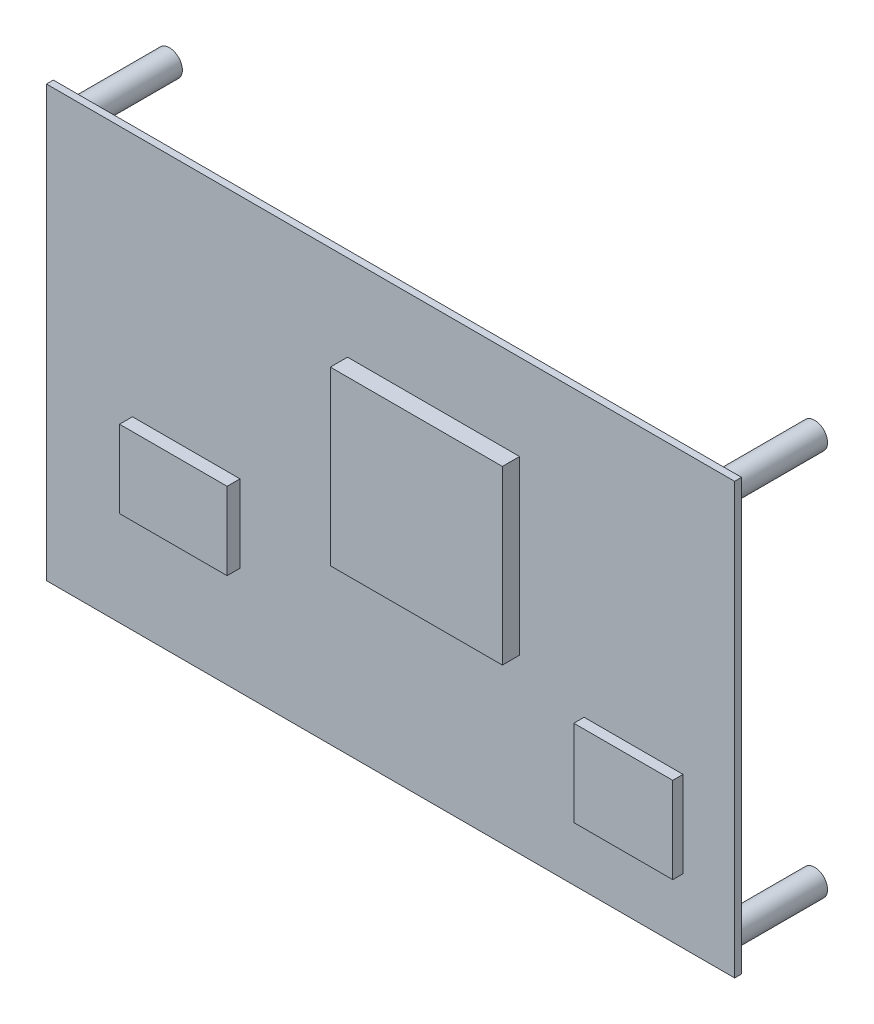
ISO-10303-21;
HEADER;
FILE_DESCRIPTION(('STEP AP214'),'2;1');
FILE_NAME('part.step','',(''),(''),'','','');
FILE_SCHEMA(('AUTOMOTIVE_DESIGN { 1 0 10303 214 1 1 1 1 }'));
ENDSEC;
DATA;
#1=APPLICATION_CONTEXT('core data for automotive mechanical design processes');
#2=APPLICATION_PROTOCOL_DEFINITION('international standard','automotive_design',2000,#1);
#3=PRODUCT_CONTEXT('',#1,'mechanical');
#4=PRODUCT('Part','Part','',(#3));
#5=PRODUCT_RELATED_PRODUCT_CATEGORY('part','',(#4));
#6=PRODUCT_DEFINITION_FORMATION('','',#4);
#7=PRODUCT_DEFINITION_CONTEXT('part definition',#1,'design');
#8=PRODUCT_DEFINITION('design','',#6,#7);
#9=PRODUCT_DEFINITION_SHAPE('','',#8);
#10=(LENGTH_UNIT() NAMED_UNIT(*) SI_UNIT(.MILLI.,.METRE.));
#11=(NAMED_UNIT(*) PLANE_ANGLE_UNIT() SI_UNIT($,.RADIAN.));
#12=(NAMED_UNIT(*) SI_UNIT($,.STERADIAN.) SOLID_ANGLE_UNIT());
#13=UNCERTAINTY_MEASURE_WITH_UNIT(LENGTH_MEASURE(1.E-05),#10,'distance_accuracy_value','');
#14=(GEOMETRIC_REPRESENTATION_CONTEXT(3) GLOBAL_UNCERTAINTY_ASSIGNED_CONTEXT((#13)) GLOBAL_UNIT_ASSIGNED_CONTEXT((#10,
#11,#12)) REPRESENTATION_CONTEXT('',''));
#15=CARTESIAN_POINT('',(0.,0.,0.));
#16=DIRECTION('',(0.,0.,1.));
#17=DIRECTION('',(1.,0.,0.));
#18=AXIS2_PLACEMENT_3D('',#15,#16,#17);
#19=CARTESIAN_POINT('',(482.,10.,345.));
#20=DIRECTION('',(0.,0.,-1.));
#21=DIRECTION('',(-1.,0.,0.));
#22=AXIS2_PLACEMENT_3D('',#19,#20,#21);
#23=CYLINDRICAL_SURFACE('',#22,3.);
#24=CARTESIAN_POINT('',(482.,10.,345.));
#25=DIRECTION('',(0.,0.,1.));
#26=DIRECTION('',(1.,0.,0.));
#27=AXIS2_PLACEMENT_3D('',#24,#25,#26);
#28=CIRCLE('',#27,3.);
#29=CARTESIAN_POINT('',(485.,10.,345.));
#30=VERTEX_POINT('',#29);
#31=EDGE_CURVE('E11',#30,#30,#28,.T.);
#32=ORIENTED_EDGE('',*,*,#31,.F.);
#33=EDGE_LOOP('',(#32));
#34=FACE_BOUND('',#33,.T.);
#35=CARTESIAN_POINT('',(482.,10.,323.));
#36=DIRECTION('',(0.,0.,1.));
#37=DIRECTION('',(1.,0.,0.));
#38=AXIS2_PLACEMENT_3D('',#35,#36,#37);
#39=CIRCLE('',#38,3.);
#40=CARTESIAN_POINT('',(485.,10.,323.));
#41=VERTEX_POINT('',#40);
#42=EDGE_CURVE('E46',#41,#41,#39,.T.);
#43=ORIENTED_EDGE('',*,*,#42,.T.);
#44=EDGE_LOOP('',(#43));
#45=FACE_BOUND('',#44,.T.);
#46=ADVANCED_FACE('F43',(#34,#45),#23,.T.);
#47=CARTESIAN_POINT('',(482.,10.,323.));
#48=DIRECTION('',(0.,0.,1.));
#49=DIRECTION('',(1.,0.,0.));
#50=AXIS2_PLACEMENT_3D('',#47,#48,#49);
#51=PLANE('',#50);
#52=ORIENTED_EDGE('',*,*,#42,.F.);
#53=EDGE_LOOP('',(#52));
#54=FACE_BOUND('',#53,.T.);
#55=ADVANCED_FACE('F299',(#54),#51,.F.);
#56=CARTESIAN_POINT('',(547.,85.,350.6));
#57=DIRECTION('',(1.,0.,0.));
#58=DIRECTION('',(0.,0.,-1.));
#59=AXIS2_PLACEMENT_3D('',#56,#57,#58);
#60=PLANE('',#59);
#61=DIRECTION('',(0.,-1.,0.));
#62=VECTOR('',#61,1.);
#63=CARTESIAN_POINT('',(547.,85.,346.6));
#64=LINE('',#63,#62);
#65=CARTESIAN_POINT('',(547.,85.,346.6));
#66=VERTEX_POINT('',#65);
#67=CARTESIAN_POINT('',(547.,45.,346.6));
#68=VERTEX_POINT('',#67);
#69=EDGE_CURVE('E257',#66,#68,#64,.T.);
#70=ORIENTED_EDGE('',*,*,#69,.T.);
#71=DIRECTION('',(0.,0.,-1.));
#72=VECTOR('',#71,1.);
#73=CARTESIAN_POINT('',(547.,45.,350.6));
#74=LINE('',#73,#72);
#75=CARTESIAN_POINT('',(547.,45.,350.6));
#76=VERTEX_POINT('',#75);
#77=EDGE_CURVE('E288',#76,#68,#74,.T.);
#78=ORIENTED_EDGE('',*,*,#77,.F.);
#79=DIRECTION('',(0.,-1.,0.));
#80=VECTOR('',#79,1.);
#81=CARTESIAN_POINT('',(547.,85.,350.6));
#82=LINE('',#81,#80);
#83=CARTESIAN_POINT('',(547.,85.,350.6));
#84=VERTEX_POINT('',#83);
#85=EDGE_CURVE('E263',#84,#76,#82,.T.);
#86=ORIENTED_EDGE('',*,*,#85,.F.);
#87=DIRECTION('',(0.,0.,-1.));
#88=VECTOR('',#87,1.);
#89=CARTESIAN_POINT('',(547.,85.,350.6));
#90=LINE('',#89,#88);
#91=EDGE_CURVE('E271',#84,#66,#90,.T.);
#92=ORIENTED_EDGE('',*,*,#91,.T.);
#93=EDGE_LOOP('',(#70,#78,#86,#92));
#94=FACE_BOUND('',#93,.T.);
#95=ADVANCED_FACE('F300',(#94),#60,.F.);
#96=CARTESIAN_POINT('',(547.,45.,350.6));
#97=DIRECTION('',(0.,1.,0.));
#98=DIRECTION('',(0.,0.,1.));
#99=AXIS2_PLACEMENT_3D('',#96,#97,#98);
#100=PLANE('',#99);
#101=DIRECTION('',(1.,0.,0.));
#102=VECTOR('',#101,1.);
#103=CARTESIAN_POINT('',(547.,45.,346.6));
#104=LINE('',#103,#102);
#105=CARTESIAN_POINT('',(587.,45.,346.6));
#106=VERTEX_POINT('',#105);
#107=EDGE_CURVE('E273',#68,#106,#104,.T.);
#108=ORIENTED_EDGE('',*,*,#107,.T.);
#109=DIRECTION('',(0.,0.,-1.));
#110=VECTOR('',#109,1.);
#111=CARTESIAN_POINT('',(587.,45.,350.6));
#112=LINE('',#111,#110);
#113=CARTESIAN_POINT('',(587.,45.,350.6));
#114=VERTEX_POINT('',#113);
#115=EDGE_CURVE('E289',#114,#106,#112,.T.);
#116=ORIENTED_EDGE('',*,*,#115,.F.);
#117=DIRECTION('',(1.,0.,0.));
#118=VECTOR('',#117,1.);
#119=CARTESIAN_POINT('',(547.,45.,350.6));
#120=LINE('',#119,#118);
#121=EDGE_CURVE('E264',#76,#114,#120,.T.);
#122=ORIENTED_EDGE('',*,*,#121,.F.);
#123=ORIENTED_EDGE('',*,*,#77,.T.);
#124=EDGE_LOOP('',(#108,#116,#122,#123));
#125=FACE_BOUND('',#124,.T.);
#126=ADVANCED_FACE('F303',(#125),#100,.F.);
#127=CARTESIAN_POINT('',(587.,45.,350.6));
#128=DIRECTION('',(-1.,0.,0.));
#129=DIRECTION('',(0.,0.,1.));
#130=AXIS2_PLACEMENT_3D('',#127,#128,#129);
#131=PLANE('',#130);
#132=DIRECTION('',(0.,1.,0.));
#133=VECTOR('',#132,1.);
#134=CARTESIAN_POINT('',(587.,45.,346.6));
#135=LINE('',#134,#133);
#136=CARTESIAN_POINT('',(587.,85.,346.6));
#137=VERTEX_POINT('',#136);
#138=EDGE_CURVE('E280',#106,#137,#135,.T.);
#139=ORIENTED_EDGE('',*,*,#138,.T.);
#140=DIRECTION('',(0.,0.,-1.));
#141=VECTOR('',#140,1.);
#142=CARTESIAN_POINT('',(587.,85.,350.6));
#143=LINE('',#142,#141);
#144=CARTESIAN_POINT('',(587.,85.,350.6));
#145=VERTEX_POINT('',#144);
#146=EDGE_CURVE('E283',#145,#137,#143,.T.);
#147=ORIENTED_EDGE('',*,*,#146,.F.);
#148=DIRECTION('',(0.,1.,0.));
#149=VECTOR('',#148,1.);
#150=CARTESIAN_POINT('',(587.,45.,350.6));
#151=LINE('',#150,#149);
#152=EDGE_CURVE('E268',#114,#145,#151,.T.);
#153=ORIENTED_EDGE('',*,*,#152,.F.);
#154=ORIENTED_EDGE('',*,*,#115,.T.);
#155=EDGE_LOOP('',(#139,#147,#153,#154));
#156=FACE_BOUND('',#155,.T.);
#157=ADVANCED_FACE('F315',(#156),#131,.F.);
#158=CARTESIAN_POINT('',(587.,85.,350.6));
#159=DIRECTION('',(0.,-1.,0.));
#160=DIRECTION('',(0.,0.,-1.));
#161=AXIS2_PLACEMENT_3D('',#158,#159,#160);
#162=PLANE('',#161);
#163=DIRECTION('',(-1.,0.,0.));
#164=VECTOR('',#163,1.);
#165=CARTESIAN_POINT('',(587.,85.,346.6));
#166=LINE('',#165,#164);
#167=EDGE_CURVE('E266',#137,#66,#166,.T.);
#168=ORIENTED_EDGE('',*,*,#167,.T.);
#169=ORIENTED_EDGE('',*,*,#91,.F.);
#170=DIRECTION('',(-1.,0.,0.));
#171=VECTOR('',#170,1.);
#172=CARTESIAN_POINT('',(587.,85.,350.6));
#173=LINE('',#172,#171);
#174=EDGE_CURVE('E59',#145,#84,#173,.T.);
#175=ORIENTED_EDGE('',*,*,#174,.F.);
#176=ORIENTED_EDGE('',*,*,#146,.T.);
#177=EDGE_LOOP('',(#168,#169,#175,#176));
#178=FACE_BOUND('',#177,.T.);
#179=ADVANCED_FACE('F312',(#178),#162,.F.);
#180=CARTESIAN_POINT('',(0.,0.,350.6));
#181=DIRECTION('',(0.,0.,1.));
#182=DIRECTION('',(1.,0.,0.));
#183=AXIS2_PLACEMENT_3D('',#180,#181,#182);
#184=PLANE('',#183);
#185=ORIENTED_EDGE('',*,*,#85,.T.);
#186=ORIENTED_EDGE('',*,*,#121,.T.);
#187=ORIENTED_EDGE('',*,*,#152,.T.);
#188=ORIENTED_EDGE('',*,*,#174,.T.);
#189=EDGE_LOOP('',(#185,#186,#187,#188));
#190=FACE_BOUND('',#189,.T.);
#191=ADVANCED_FACE('F317',(#190),#184,.T.);
#192=CARTESIAN_POINT('',(0.,0.,346.6));
#193=DIRECTION('',(0.,0.,1.));
#194=DIRECTION('',(1.,0.,0.));
#195=AXIS2_PLACEMENT_3D('',#192,#193,#194);
#196=PLANE('',#195);
#197=DIRECTION('',(1.,0.,0.));
#198=VECTOR('',#197,1.);
#199=CARTESIAN_POINT('',(602.,20.,346.6));
#200=LINE('',#199,#198);
#201=CARTESIAN_POINT('',(602.,20.,346.6));
#202=VERTEX_POINT('',#201);
#203=CARTESIAN_POINT('',(625.,20.,346.6));
#204=VERTEX_POINT('',#203);
#205=EDGE_CURVE('E612',#202,#204,#200,.T.);
#206=ORIENTED_EDGE('',*,*,#205,.F.);
#207=DIRECTION('',(0.,-1.,0.));
#208=VECTOR('',#207,1.);
#209=CARTESIAN_POINT('',(602.,40.,346.6));
#210=LINE('',#209,#208);
#211=CARTESIAN_POINT('',(602.,40.,346.6));
#212=VERTEX_POINT('',#211);
#213=EDGE_CURVE('E173',#212,#202,#210,.T.);
#214=ORIENTED_EDGE('',*,*,#213,.F.);
#215=DIRECTION('',(-1.,0.,0.));
#216=VECTOR('',#215,1.);
#217=CARTESIAN_POINT('',(625.,40.,346.6));
#218=LINE('',#217,#216);
#219=CARTESIAN_POINT('',(625.,40.,346.6));
#220=VERTEX_POINT('',#219);
#221=EDGE_CURVE('E168',#220,#212,#218,.T.);
#222=ORIENTED_EDGE('',*,*,#221,.F.);
#223=DIRECTION('',(0.,1.,0.));
#224=VECTOR('',#223,1.);
#225=CARTESIAN_POINT('',(625.,20.,346.6));
#226=LINE('',#225,#224);
#227=EDGE_CURVE('E609',#204,#220,#226,.T.);
#228=ORIENTED_EDGE('',*,*,#227,.F.);
#229=EDGE_LOOP('',(#206,#214,#222,#228));
#230=FACE_BOUND('',#229,.T.);
#231=DIRECTION('',(0.,-1.,0.));
#232=VECTOR('',#231,1.);
#233=CARTESIAN_POINT('',(477.,105.,346.6));
#234=LINE('',#233,#232);
#235=CARTESIAN_POINT('',(477.,105.,346.6));
#236=VERTEX_POINT('',#235);
#237=CARTESIAN_POINT('',(477.,5.,346.6));
#238=VERTEX_POINT('',#237);
#239=EDGE_CURVE('E221',#236,#238,#234,.T.);
#240=ORIENTED_EDGE('',*,*,#239,.T.);
#241=DIRECTION('',(1.,0.,0.));
#242=VECTOR('',#241,1.);
#243=CARTESIAN_POINT('',(477.,5.,346.6));
#244=LINE('',#243,#242);
#245=CARTESIAN_POINT('',(637.,5.,346.6));
#246=VERTEX_POINT('',#245);
#247=EDGE_CURVE('E227',#238,#246,#244,.T.);
#248=ORIENTED_EDGE('',*,*,#247,.T.);
#249=DIRECTION('',(0.,1.,0.));
#250=VECTOR('',#249,1.);
#251=CARTESIAN_POINT('',(637.,5.,346.6));
#252=LINE('',#251,#250);
#253=CARTESIAN_POINT('',(637.,105.,346.6));
#254=VERTEX_POINT('',#253);
#255=EDGE_CURVE('E230',#246,#254,#252,.T.);
#256=ORIENTED_EDGE('',*,*,#255,.T.);
#257=DIRECTION('',(-1.,0.,0.));
#258=VECTOR('',#257,1.);
#259=CARTESIAN_POINT('',(637.,105.,346.6));
#260=LINE('',#259,#258);
#261=EDGE_CURVE('E234',#254,#236,#260,.T.);
#262=ORIENTED_EDGE('',*,*,#261,.T.);
#263=EDGE_LOOP('',(#240,#248,#256,#262));
#264=FACE_BOUND('',#263,.T.);
#265=DIRECTION('',(0.,-1.,0.));
#266=VECTOR('',#265,1.);
#267=CARTESIAN_POINT('',(497.,48.,346.6));
#268=LINE('',#267,#266);
#269=CARTESIAN_POINT('',(497.,48.,346.6));
#270=VERTEX_POINT('',#269);
#271=CARTESIAN_POINT('',(497.,30.,346.6));
#272=VERTEX_POINT('',#271);
#273=EDGE_CURVE('E176',#270,#272,#268,.T.);
#274=ORIENTED_EDGE('',*,*,#273,.F.);
#275=DIRECTION('',(-1.,0.,0.));
#276=VECTOR('',#275,1.);
#277=CARTESIAN_POINT('',(522.,48.,346.6));
#278=LINE('',#277,#276);
#279=CARTESIAN_POINT('',(522.,48.,346.6));
#280=VERTEX_POINT('',#279);
#281=EDGE_CURVE('E188',#280,#270,#278,.T.);
#282=ORIENTED_EDGE('',*,*,#281,.F.);
#283=DIRECTION('',(0.,1.,0.));
#284=VECTOR('',#283,1.);
#285=CARTESIAN_POINT('',(522.,30.,346.6));
#286=LINE('',#285,#284);
#287=CARTESIAN_POINT('',(522.,30.,346.6));
#288=VERTEX_POINT('',#287);
#289=EDGE_CURVE('E203',#288,#280,#286,.T.);
#290=ORIENTED_EDGE('',*,*,#289,.F.);
#291=DIRECTION('',(1.,0.,0.));
#292=VECTOR('',#291,1.);
#293=CARTESIAN_POINT('',(497.,30.,346.6));
#294=LINE('',#293,#292);
#295=EDGE_CURVE('E196',#272,#288,#294,.T.);
#296=ORIENTED_EDGE('',*,*,#295,.F.);
#297=EDGE_LOOP('',(#274,#282,#290,#296));
#298=FACE_BOUND('',#297,.T.);
#299=ORIENTED_EDGE('',*,*,#69,.F.);
#300=ORIENTED_EDGE('',*,*,#167,.F.);
#301=ORIENTED_EDGE('',*,*,#138,.F.);
#302=ORIENTED_EDGE('',*,*,#107,.F.);
#303=EDGE_LOOP('',(#299,#300,#301,#302));
#304=FACE_BOUND('',#303,.T.);
#305=ADVANCED_FACE('F323',(#230,#264,#298,#304),#196,.T.);
#306=CARTESIAN_POINT('',(482.,100.,345.));
#307=DIRECTION('',(0.,0.,-1.));
#308=DIRECTION('',(-1.,0.,0.));
#309=AXIS2_PLACEMENT_3D('',#306,#307,#308);
#310=CYLINDRICAL_SURFACE('',#309,3.);
#311=CARTESIAN_POINT('',(482.,100.,345.));
#312=DIRECTION('',(0.,0.,1.));
#313=DIRECTION('',(1.,0.,0.));
#314=AXIS2_PLACEMENT_3D('',#311,#312,#313);
#315=CIRCLE('',#314,3.);
#316=CARTESIAN_POINT('',(485.,100.,345.));
#317=VERTEX_POINT('',#316);
#318=EDGE_CURVE('E260',#317,#317,#315,.T.);
#319=ORIENTED_EDGE('',*,*,#318,.F.);
#320=EDGE_LOOP('',(#319));
#321=FACE_BOUND('',#320,.T.);
#322=CARTESIAN_POINT('',(482.,100.,323.));
#323=DIRECTION('',(0.,0.,1.));
#324=DIRECTION('',(1.,0.,0.));
#325=AXIS2_PLACEMENT_3D('',#322,#323,#324);
#326=CIRCLE('',#325,3.);
#327=CARTESIAN_POINT('',(485.,100.,323.));
#328=VERTEX_POINT('',#327);
#329=EDGE_CURVE('E258',#328,#328,#326,.T.);
#330=ORIENTED_EDGE('',*,*,#329,.T.);
#331=EDGE_LOOP('',(#330));
#332=FACE_BOUND('',#331,.T.);
#333=ADVANCED_FACE('F322',(#321,#332),#310,.T.);
#334=CARTESIAN_POINT('',(482.,100.,323.));
#335=DIRECTION('',(0.,0.,1.));
#336=DIRECTION('',(1.,0.,0.));
#337=AXIS2_PLACEMENT_3D('',#334,#335,#336);
#338=PLANE('',#337);
#339=ORIENTED_EDGE('',*,*,#329,.F.);
#340=EDGE_LOOP('',(#339));
#341=FACE_BOUND('',#340,.T.);
#342=ADVANCED_FACE('F330',(#341),#338,.F.);
#343=CARTESIAN_POINT('',(477.,105.,346.6));
#344=DIRECTION('',(1.,0.,0.));
#345=DIRECTION('',(0.,0.,-1.));
#346=AXIS2_PLACEMENT_3D('',#343,#344,#345);
#347=PLANE('',#346);
#348=DIRECTION('',(0.,-1.,0.));
#349=VECTOR('',#348,1.);
#350=CARTESIAN_POINT('',(477.,105.,345.));
#351=LINE('',#350,#349);
#352=CARTESIAN_POINT('',(477.,105.,345.));
#353=VERTEX_POINT('',#352);
#354=CARTESIAN_POINT('',(477.,5.,345.));
#355=VERTEX_POINT('',#354);
#356=EDGE_CURVE('E222',#353,#355,#351,.T.);
#357=ORIENTED_EDGE('',*,*,#356,.T.);
#358=DIRECTION('',(0.,0.,-1.));
#359=VECTOR('',#358,1.);
#360=CARTESIAN_POINT('',(477.,5.,346.6));
#361=LINE('',#360,#359);
#362=EDGE_CURVE('E248',#238,#355,#361,.T.);
#363=ORIENTED_EDGE('',*,*,#362,.F.);
#364=ORIENTED_EDGE('',*,*,#239,.F.);
#365=DIRECTION('',(0.,0.,-1.));
#366=VECTOR('',#365,1.);
#367=CARTESIAN_POINT('',(477.,105.,346.6));
#368=LINE('',#367,#366);
#369=EDGE_CURVE('E231',#236,#353,#368,.T.);
#370=ORIENTED_EDGE('',*,*,#369,.T.);
#371=EDGE_LOOP('',(#357,#363,#364,#370));
#372=FACE_BOUND('',#371,.T.);
#373=ADVANCED_FACE('F332',(#372),#347,.F.);
#374=CARTESIAN_POINT('',(477.,5.,346.6));
#375=DIRECTION('',(0.,1.,0.));
#376=DIRECTION('',(0.,0.,1.));
#377=AXIS2_PLACEMENT_3D('',#374,#375,#376);
#378=PLANE('',#377);
#379=DIRECTION('',(1.,0.,0.));
#380=VECTOR('',#379,1.);
#381=CARTESIAN_POINT('',(477.,5.,345.));
#382=LINE('',#381,#380);
#383=CARTESIAN_POINT('',(637.,5.,345.));
#384=VERTEX_POINT('',#383);
#385=EDGE_CURVE('E240',#355,#384,#382,.T.);
#386=ORIENTED_EDGE('',*,*,#385,.T.);
#387=DIRECTION('',(0.,0.,-1.));
#388=VECTOR('',#387,1.);
#389=CARTESIAN_POINT('',(637.,5.,346.6));
#390=LINE('',#389,#388);
#391=EDGE_CURVE('E249',#246,#384,#390,.T.);
#392=ORIENTED_EDGE('',*,*,#391,.F.);
#393=ORIENTED_EDGE('',*,*,#247,.F.);
#394=ORIENTED_EDGE('',*,*,#362,.T.);
#395=EDGE_LOOP('',(#386,#392,#393,#394));
#396=FACE_BOUND('',#395,.T.);
#397=ADVANCED_FACE('F333',(#396),#378,.F.);
#398=CARTESIAN_POINT('',(637.,5.,346.6));
#399=DIRECTION('',(-1.,0.,0.));
#400=DIRECTION('',(0.,0.,1.));
#401=AXIS2_PLACEMENT_3D('',#398,#399,#400);
#402=PLANE('',#401);
#403=DIRECTION('',(0.,1.,0.));
#404=VECTOR('',#403,1.);
#405=CARTESIAN_POINT('',(637.,5.,345.));
#406=LINE('',#405,#404);
#407=CARTESIAN_POINT('',(637.,105.,345.));
#408=VERTEX_POINT('',#407);
#409=EDGE_CURVE('E239',#384,#408,#406,.T.);
#410=ORIENTED_EDGE('',*,*,#409,.T.);
#411=DIRECTION('',(0.,0.,-1.));
#412=VECTOR('',#411,1.);
#413=CARTESIAN_POINT('',(637.,105.,346.6));
#414=LINE('',#413,#412);
#415=EDGE_CURVE('E243',#254,#408,#414,.T.);
#416=ORIENTED_EDGE('',*,*,#415,.F.);
#417=ORIENTED_EDGE('',*,*,#255,.F.);
#418=ORIENTED_EDGE('',*,*,#391,.T.);
#419=EDGE_LOOP('',(#410,#416,#417,#418));
#420=FACE_BOUND('',#419,.T.);
#421=ADVANCED_FACE('F338',(#420),#402,.F.);
#422=CARTESIAN_POINT('',(637.,105.,346.6));
#423=DIRECTION('',(0.,-1.,0.));
#424=DIRECTION('',(0.,0.,-1.));
#425=AXIS2_PLACEMENT_3D('',#422,#423,#424);
#426=PLANE('',#425);
#427=DIRECTION('',(-1.,0.,0.));
#428=VECTOR('',#427,1.);
#429=CARTESIAN_POINT('',(637.,105.,345.));
#430=LINE('',#429,#428);
#431=EDGE_CURVE('E229',#408,#353,#430,.T.);
#432=ORIENTED_EDGE('',*,*,#431,.T.);
#433=ORIENTED_EDGE('',*,*,#369,.F.);
#434=ORIENTED_EDGE('',*,*,#261,.F.);
#435=ORIENTED_EDGE('',*,*,#415,.T.);
#436=EDGE_LOOP('',(#432,#433,#434,#435));
#437=FACE_BOUND('',#436,.T.);
#438=ADVANCED_FACE('F345',(#437),#426,.F.);
#439=CARTESIAN_POINT('',(0.,0.,345.));
#440=DIRECTION('',(0.,0.,1.));
#441=DIRECTION('',(1.,0.,0.));
#442=AXIS2_PLACEMENT_3D('',#439,#440,#441);
#443=PLANE('',#442);
#444=ORIENTED_EDGE('',*,*,#31,.T.);
#445=EDGE_LOOP('',(#444));
#446=FACE_BOUND('',#445,.T.);
#447=ORIENTED_EDGE('',*,*,#318,.T.);
#448=EDGE_LOOP('',(#447));
#449=FACE_BOUND('',#448,.T.);
#450=CARTESIAN_POINT('',(632.,100.,345.));
#451=DIRECTION('',(0.,0.,1.));
#452=DIRECTION('',(1.,0.,0.));
#453=AXIS2_PLACEMENT_3D('',#450,#451,#452);
#454=CIRCLE('',#453,3.);
#455=CARTESIAN_POINT('',(635.,100.,345.));
#456=VERTEX_POINT('',#455);
#457=EDGE_CURVE('E251',#456,#456,#454,.F.);
#458=ORIENTED_EDGE('',*,*,#457,.F.);
#459=EDGE_LOOP('',(#458));
#460=FACE_BOUND('',#459,.T.);
#461=CARTESIAN_POINT('',(632.,10.,345.));
#462=DIRECTION('',(0.,0.,1.));
#463=DIRECTION('',(1.,0.,0.));
#464=AXIS2_PLACEMENT_3D('',#461,#462,#463);
#465=CIRCLE('',#464,3.);
#466=CARTESIAN_POINT('',(635.,10.,345.));
#467=VERTEX_POINT('',#466);
#468=EDGE_CURVE('E217',#467,#467,#465,.T.);
#469=ORIENTED_EDGE('',*,*,#468,.T.);
#470=EDGE_LOOP('',(#469));
#471=FACE_BOUND('',#470,.T.);
#472=ORIENTED_EDGE('',*,*,#356,.F.);
#473=ORIENTED_EDGE('',*,*,#431,.F.);
#474=ORIENTED_EDGE('',*,*,#409,.F.);
#475=ORIENTED_EDGE('',*,*,#385,.F.);
#476=EDGE_LOOP('',(#472,#473,#474,#475));
#477=FACE_BOUND('',#476,.T.);
#478=ADVANCED_FACE('F350',(#446,#449,#460,#471,#477),#443,.F.);
#479=CARTESIAN_POINT('',(632.,10.,345.));
#480=DIRECTION('',(0.,0.,-1.));
#481=DIRECTION('',(-1.,0.,0.));
#482=AXIS2_PLACEMENT_3D('',#479,#480,#481);
#483=CYLINDRICAL_SURFACE('',#482,3.);
#484=ORIENTED_EDGE('',*,*,#468,.F.);
#485=EDGE_LOOP('',(#484));
#486=FACE_BOUND('',#485,.T.);
#487=CARTESIAN_POINT('',(632.,10.,323.));
#488=DIRECTION('',(0.,0.,1.));
#489=DIRECTION('',(1.,0.,0.));
#490=AXIS2_PLACEMENT_3D('',#487,#488,#489);
#491=CIRCLE('',#490,3.);
#492=CARTESIAN_POINT('',(635.,10.,323.));
#493=VERTEX_POINT('',#492);
#494=EDGE_CURVE('E220',#493,#493,#491,.T.);
#495=ORIENTED_EDGE('',*,*,#494,.T.);
#496=EDGE_LOOP('',(#495));
#497=FACE_BOUND('',#496,.T.);
#498=ADVANCED_FACE('F351',(#486,#497),#483,.T.);
#499=CARTESIAN_POINT('',(632.,10.,323.));
#500=DIRECTION('',(0.,0.,1.));
#501=DIRECTION('',(1.,0.,0.));
#502=AXIS2_PLACEMENT_3D('',#499,#500,#501);
#503=PLANE('',#502);
#504=ORIENTED_EDGE('',*,*,#494,.F.);
#505=EDGE_LOOP('',(#504));
#506=FACE_BOUND('',#505,.T.);
#507=ADVANCED_FACE('F360',(#506),#503,.F.);
#508=CARTESIAN_POINT('',(497.,48.,349.6));
#509=DIRECTION('',(1.,0.,0.));
#510=DIRECTION('',(0.,0.,-1.));
#511=AXIS2_PLACEMENT_3D('',#508,#509,#510);
#512=PLANE('',#511);
#513=ORIENTED_EDGE('',*,*,#273,.T.);
#514=DIRECTION('',(0.,0.,-1.));
#515=VECTOR('',#514,1.);
#516=CARTESIAN_POINT('',(497.,30.,349.6));
#517=LINE('',#516,#515);
#518=CARTESIAN_POINT('',(497.,30.,349.6));
#519=VERTEX_POINT('',#518);
#520=EDGE_CURVE('E212',#519,#272,#517,.T.);
#521=ORIENTED_EDGE('',*,*,#520,.F.);
#522=DIRECTION('',(0.,-1.,0.));
#523=VECTOR('',#522,1.);
#524=CARTESIAN_POINT('',(497.,48.,349.6));
#525=LINE('',#524,#523);
#526=CARTESIAN_POINT('',(497.,48.,349.6));
#527=VERTEX_POINT('',#526);
#528=EDGE_CURVE('E183',#527,#519,#525,.T.);
#529=ORIENTED_EDGE('',*,*,#528,.F.);
#530=DIRECTION('',(0.,0.,-1.));
#531=VECTOR('',#530,1.);
#532=CARTESIAN_POINT('',(497.,48.,349.6));
#533=LINE('',#532,#531);
#534=EDGE_CURVE('E193',#527,#270,#533,.T.);
#535=ORIENTED_EDGE('',*,*,#534,.T.);
#536=EDGE_LOOP('',(#513,#521,#529,#535));
#537=FACE_BOUND('',#536,.T.);
#538=ADVANCED_FACE('F362',(#537),#512,.F.);
#539=CARTESIAN_POINT('',(497.,30.,349.6));
#540=DIRECTION('',(0.,1.,0.));
#541=DIRECTION('',(0.,0.,1.));
#542=AXIS2_PLACEMENT_3D('',#539,#540,#541);
#543=PLANE('',#542);
#544=ORIENTED_EDGE('',*,*,#295,.T.);
#545=DIRECTION('',(0.,0.,-1.));
#546=VECTOR('',#545,1.);
#547=CARTESIAN_POINT('',(522.,30.,349.6));
#548=LINE('',#547,#546);
#549=CARTESIAN_POINT('',(522.,30.,349.6));
#550=VERTEX_POINT('',#549);
#551=EDGE_CURVE('E211',#550,#288,#548,.T.);
#552=ORIENTED_EDGE('',*,*,#551,.F.);
#553=DIRECTION('',(1.,0.,0.));
#554=VECTOR('',#553,1.);
#555=CARTESIAN_POINT('',(497.,30.,349.6));
#556=LINE('',#555,#554);
#557=EDGE_CURVE('E189',#519,#550,#556,.T.);
#558=ORIENTED_EDGE('',*,*,#557,.F.);
#559=ORIENTED_EDGE('',*,*,#520,.T.);
#560=EDGE_LOOP('',(#544,#552,#558,#559));
#561=FACE_BOUND('',#560,.T.);
#562=ADVANCED_FACE('F368',(#561),#543,.F.);
#563=CARTESIAN_POINT('',(522.,30.,349.6));
#564=DIRECTION('',(-1.,0.,0.));
#565=DIRECTION('',(0.,0.,1.));
#566=AXIS2_PLACEMENT_3D('',#563,#564,#565);
#567=PLANE('',#566);
#568=ORIENTED_EDGE('',*,*,#289,.T.);
#569=DIRECTION('',(0.,0.,-1.));
#570=VECTOR('',#569,1.);
#571=CARTESIAN_POINT('',(522.,48.,349.6));
#572=LINE('',#571,#570);
#573=CARTESIAN_POINT('',(522.,48.,349.6));
#574=VERTEX_POINT('',#573);
#575=EDGE_CURVE('E208',#574,#280,#572,.T.);
#576=ORIENTED_EDGE('',*,*,#575,.F.);
#577=DIRECTION('',(0.,1.,0.));
#578=VECTOR('',#577,1.);
#579=CARTESIAN_POINT('',(522.,30.,349.6));
#580=LINE('',#579,#578);
#581=EDGE_CURVE('E192',#550,#574,#580,.T.);
#582=ORIENTED_EDGE('',*,*,#581,.F.);
#583=ORIENTED_EDGE('',*,*,#551,.T.);
#584=EDGE_LOOP('',(#568,#576,#582,#583));
#585=FACE_BOUND('',#584,.T.);
#586=ADVANCED_FACE('F367',(#585),#567,.F.);
#587=CARTESIAN_POINT('',(522.,48.,349.6));
#588=DIRECTION('',(0.,-1.,0.));
#589=DIRECTION('',(0.,0.,-1.));
#590=AXIS2_PLACEMENT_3D('',#587,#588,#589);
#591=PLANE('',#590);
#592=ORIENTED_EDGE('',*,*,#281,.T.);
#593=ORIENTED_EDGE('',*,*,#534,.F.);
#594=DIRECTION('',(-1.,0.,0.));
#595=VECTOR('',#594,1.);
#596=CARTESIAN_POINT('',(522.,48.,349.6));
#597=LINE('',#596,#595);
#598=EDGE_CURVE('E195',#574,#527,#597,.T.);
#599=ORIENTED_EDGE('',*,*,#598,.F.);
#600=ORIENTED_EDGE('',*,*,#575,.T.);
#601=EDGE_LOOP('',(#592,#593,#599,#600));
#602=FACE_BOUND('',#601,.T.);
#603=ADVANCED_FACE('F372',(#602),#591,.F.);
#604=CARTESIAN_POINT('',(0.,0.,349.6));
#605=DIRECTION('',(0.,0.,1.));
#606=DIRECTION('',(1.,0.,0.));
#607=AXIS2_PLACEMENT_3D('',#604,#605,#606);
#608=PLANE('',#607);
#609=ORIENTED_EDGE('',*,*,#528,.T.);
#610=ORIENTED_EDGE('',*,*,#557,.T.);
#611=ORIENTED_EDGE('',*,*,#581,.T.);
#612=ORIENTED_EDGE('',*,*,#598,.T.);
#613=EDGE_LOOP('',(#609,#610,#611,#612));
#614=FACE_BOUND('',#613,.T.);
#615=ADVANCED_FACE('F378',(#614),#608,.T.);
#616=CARTESIAN_POINT('',(632.,100.,345.));
#617=DIRECTION('',(0.,0.,-1.));
#618=DIRECTION('',(-1.,0.,0.));
#619=AXIS2_PLACEMENT_3D('',#616,#617,#618);
#620=CYLINDRICAL_SURFACE('',#619,3.);
#621=ORIENTED_EDGE('',*,*,#457,.T.);
#622=EDGE_LOOP('',(#621));
#623=FACE_BOUND('',#622,.T.);
#624=CARTESIAN_POINT('',(632.,100.,323.));
#625=DIRECTION('',(0.,0.,1.));
#626=DIRECTION('',(1.,0.,0.));
#627=AXIS2_PLACEMENT_3D('',#624,#625,#626);
#628=CIRCLE('',#627,3.);
#629=CARTESIAN_POINT('',(635.,100.,323.));
#630=VERTEX_POINT('',#629);
#631=EDGE_CURVE('E177',#630,#630,#628,.T.);
#632=ORIENTED_EDGE('',*,*,#631,.T.);
#633=EDGE_LOOP('',(#632));
#634=FACE_BOUND('',#633,.T.);
#635=ADVANCED_FACE('F385',(#623,#634),#620,.T.);
#636=CARTESIAN_POINT('',(632.,100.,323.));
#637=DIRECTION('',(0.,0.,1.));
#638=DIRECTION('',(1.,0.,0.));
#639=AXIS2_PLACEMENT_3D('',#636,#637,#638);
#640=PLANE('',#639);
#641=ORIENTED_EDGE('',*,*,#631,.F.);
#642=EDGE_LOOP('',(#641));
#643=FACE_BOUND('',#642,.T.);
#644=ADVANCED_FACE('F387',(#643),#640,.F.);
#645=CARTESIAN_POINT('',(602.,40.,349.));
#646=DIRECTION('',(1.,0.,0.));
#647=DIRECTION('',(0.,0.,-1.));
#648=AXIS2_PLACEMENT_3D('',#645,#646,#647);
#649=PLANE('',#648);
#650=ORIENTED_EDGE('',*,*,#213,.T.);
#651=DIRECTION('',(0.,0.,-1.));
#652=VECTOR('',#651,1.);
#653=CARTESIAN_POINT('',(602.,20.,349.));
#654=LINE('',#653,#652);
#655=CARTESIAN_POINT('',(602.,20.,349.));
#656=VERTEX_POINT('',#655);
#657=EDGE_CURVE('E152',#656,#202,#654,.T.);
#658=ORIENTED_EDGE('',*,*,#657,.F.);
#659=DIRECTION('',(0.,-1.,0.));
#660=VECTOR('',#659,1.);
#661=CARTESIAN_POINT('',(602.,40.,349.));
#662=LINE('',#661,#660);
#663=CARTESIAN_POINT('',(602.,40.,349.));
#664=VERTEX_POINT('',#663);
#665=EDGE_CURVE('E161',#664,#656,#662,.T.);
#666=ORIENTED_EDGE('',*,*,#665,.F.);
#667=DIRECTION('',(0.,0.,-1.));
#668=VECTOR('',#667,1.);
#669=CARTESIAN_POINT('',(602.,40.,349.));
#670=LINE('',#669,#668);
#671=EDGE_CURVE('E603',#664,#212,#670,.T.);
#672=ORIENTED_EDGE('',*,*,#671,.T.);
#673=EDGE_LOOP('',(#650,#658,#666,#672));
#674=FACE_BOUND('',#673,.T.);
#675=ADVANCED_FACE('F172',(#674),#649,.F.);
#676=CARTESIAN_POINT('',(602.,20.,349.));
#677=DIRECTION('',(0.,1.,0.));
#678=DIRECTION('',(0.,0.,1.));
#679=AXIS2_PLACEMENT_3D('',#676,#677,#678);
#680=PLANE('',#679);
#681=ORIENTED_EDGE('',*,*,#205,.T.);
#682=DIRECTION('',(0.,0.,-1.));
#683=VECTOR('',#682,1.);
#684=CARTESIAN_POINT('',(625.,20.,349.));
#685=LINE('',#684,#683);
#686=CARTESIAN_POINT('',(625.,20.,349.));
#687=VERTEX_POINT('',#686);
#688=EDGE_CURVE('E160',#687,#204,#685,.T.);
#689=ORIENTED_EDGE('',*,*,#688,.F.);
#690=DIRECTION('',(1.,0.,0.));
#691=VECTOR('',#690,1.);
#692=CARTESIAN_POINT('',(602.,20.,349.));
#693=LINE('',#692,#691);
#694=EDGE_CURVE('E147',#656,#687,#693,.T.);
#695=ORIENTED_EDGE('',*,*,#694,.F.);
#696=ORIENTED_EDGE('',*,*,#657,.T.);
#697=EDGE_LOOP('',(#681,#689,#695,#696));
#698=FACE_BOUND('',#697,.T.);
#699=ADVANCED_FACE('F155',(#698),#680,.F.);
#700=CARTESIAN_POINT('',(625.,20.,349.));
#701=DIRECTION('',(-1.,0.,0.));
#702=DIRECTION('',(0.,0.,1.));
#703=AXIS2_PLACEMENT_3D('',#700,#701,#702);
#704=PLANE('',#703);
#705=ORIENTED_EDGE('',*,*,#227,.T.);
#706=DIRECTION('',(0.,0.,-1.));
#707=VECTOR('',#706,1.);
#708=CARTESIAN_POINT('',(625.,40.,349.));
#709=LINE('',#708,#707);
#710=CARTESIAN_POINT('',(625.,40.,349.));
#711=VERTEX_POINT('',#710);
#712=EDGE_CURVE('E182',#711,#220,#709,.T.);
#713=ORIENTED_EDGE('',*,*,#712,.F.);
#714=DIRECTION('',(0.,1.,0.));
#715=VECTOR('',#714,1.);
#716=CARTESIAN_POINT('',(625.,20.,349.));
#717=LINE('',#716,#715);
#718=EDGE_CURVE('E159',#687,#711,#717,.T.);
#719=ORIENTED_EDGE('',*,*,#718,.F.);
#720=ORIENTED_EDGE('',*,*,#688,.T.);
#721=EDGE_LOOP('',(#705,#713,#719,#720));
#722=FACE_BOUND('',#721,.T.);
#723=ADVANCED_FACE('F395',(#722),#704,.F.);
#724=CARTESIAN_POINT('',(625.,40.,349.));
#725=DIRECTION('',(0.,-1.,0.));
#726=DIRECTION('',(0.,0.,-1.));
#727=AXIS2_PLACEMENT_3D('',#724,#725,#726);
#728=PLANE('',#727);
#729=ORIENTED_EDGE('',*,*,#221,.T.);
#730=ORIENTED_EDGE('',*,*,#671,.F.);
#731=DIRECTION('',(-1.,0.,0.));
#732=VECTOR('',#731,1.);
#733=CARTESIAN_POINT('',(625.,40.,349.));
#734=LINE('',#733,#732);
#735=EDGE_CURVE('E167',#711,#664,#734,.T.);
#736=ORIENTED_EDGE('',*,*,#735,.F.);
#737=ORIENTED_EDGE('',*,*,#712,.T.);
#738=EDGE_LOOP('',(#729,#730,#736,#737));
#739=FACE_BOUND('',#738,.T.);
#740=ADVANCED_FACE('F400',(#739),#728,.F.);
#741=CARTESIAN_POINT('',(0.,0.,349.));
#742=DIRECTION('',(0.,0.,1.));
#743=DIRECTION('',(1.,0.,0.));
#744=AXIS2_PLACEMENT_3D('',#741,#742,#743);
#745=PLANE('',#744);
#746=ORIENTED_EDGE('',*,*,#665,.T.);
#747=ORIENTED_EDGE('',*,*,#694,.T.);
#748=ORIENTED_EDGE('',*,*,#718,.T.);
#749=ORIENTED_EDGE('',*,*,#735,.T.);
#750=EDGE_LOOP('',(#746,#747,#748,#749));
#751=FACE_BOUND('',#750,.T.);
#752=ADVANCED_FACE('F163',(#751),#745,.T.);
#753=CLOSED_SHELL('',(#46,#55,#95,#126,#157,#179,#191,#305,#333,#342,#373,#397,#421,#438,#478,
#498,#507,#538,#562,#586,#603,#615,#635,#644,#675,#699,#723,#740,#752));
#754=MANIFOLD_SOLID_BREP('B2',#753);
#755=ADVANCED_BREP_SHAPE_REPRESENTATION('',(#18,#754),#14);
#756=SHAPE_DEFINITION_REPRESENTATION(#9,#755);
ENDSEC;
END-ISO-10303-21;
